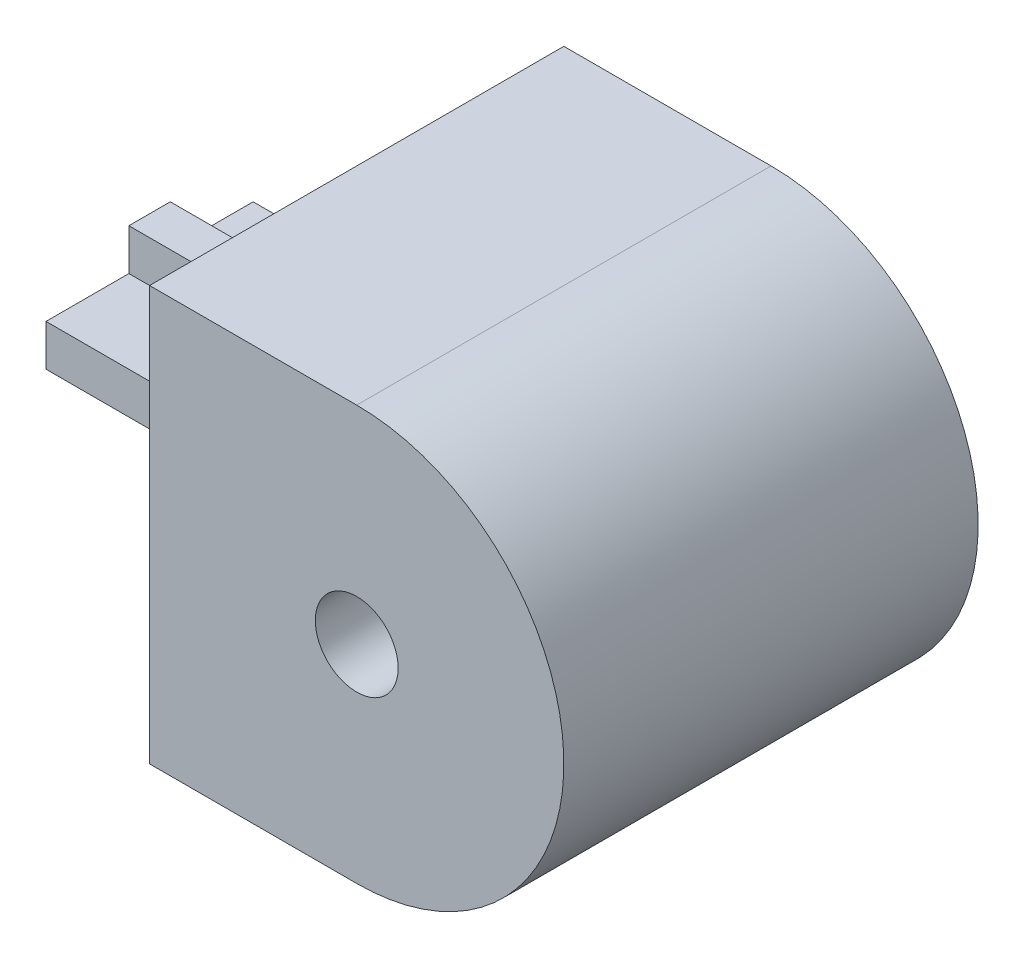
ISO-10303-21;
HEADER;
FILE_DESCRIPTION(('STEP AP214'),'2;1');
FILE_NAME('part.step','',(''),(''),'','','');
FILE_SCHEMA(('AUTOMOTIVE_DESIGN { 1 0 10303 214 1 1 1 1 }'));
ENDSEC;
DATA;
#1=APPLICATION_CONTEXT('core data for automotive mechanical design processes');
#2=APPLICATION_PROTOCOL_DEFINITION('international standard','automotive_design',2000,#1);
#3=PRODUCT_CONTEXT('',#1,'mechanical');
#4=PRODUCT('Part','Part','',(#3));
#5=PRODUCT_RELATED_PRODUCT_CATEGORY('part','',(#4));
#6=PRODUCT_DEFINITION_FORMATION('','',#4);
#7=PRODUCT_DEFINITION_CONTEXT('part definition',#1,'design');
#8=PRODUCT_DEFINITION('design','',#6,#7);
#9=PRODUCT_DEFINITION_SHAPE('','',#8);
#10=(LENGTH_UNIT() NAMED_UNIT(*) SI_UNIT(.MILLI.,.METRE.));
#11=(NAMED_UNIT(*) PLANE_ANGLE_UNIT() SI_UNIT($,.RADIAN.));
#12=(NAMED_UNIT(*) SI_UNIT($,.STERADIAN.) SOLID_ANGLE_UNIT());
#13=UNCERTAINTY_MEASURE_WITH_UNIT(LENGTH_MEASURE(1.E-05),#10,'distance_accuracy_value','');
#14=(GEOMETRIC_REPRESENTATION_CONTEXT(3) GLOBAL_UNCERTAINTY_ASSIGNED_CONTEXT((#13)) GLOBAL_UNIT_ASSIGNED_CONTEXT((#10,
#11,#12)) REPRESENTATION_CONTEXT('',''));
#15=CARTESIAN_POINT('',(0.,0.,0.));
#16=DIRECTION('',(0.,0.,1.));
#17=DIRECTION('',(1.,0.,0.));
#18=AXIS2_PLACEMENT_3D('',#15,#16,#17);
#19=CARTESIAN_POINT('',(0.,5.,5.));
#20=DIRECTION('',(1.,0.,0.));
#21=DIRECTION('',(0.,0.,-1.));
#22=AXIS2_PLACEMENT_3D('',#19,#20,#21);
#23=PLANE('',#22);
#24=DIRECTION('',(0.,-1.,0.));
#25=VECTOR('',#24,1.);
#26=CARTESIAN_POINT('',(0.,5.,0.));
#27=LINE('',#26,#25);
#28=CARTESIAN_POINT('',(0.,5.,0.));
#29=VERTEX_POINT('',#28);
#30=CARTESIAN_POINT('',(0.,0.,0.));
#31=VERTEX_POINT('',#30);
#32=EDGE_CURVE('E181',#29,#31,#27,.T.);
#33=ORIENTED_EDGE('',*,*,#32,.T.);
#34=DIRECTION('',(0.,0.,-1.));
#35=VECTOR('',#34,1.);
#36=CARTESIAN_POINT('',(0.,0.,5.));
#37=LINE('',#36,#35);
#38=CARTESIAN_POINT('',(0.,0.,5.));
#39=VERTEX_POINT('',#38);
#40=EDGE_CURVE('E11',#39,#31,#37,.T.);
#41=ORIENTED_EDGE('',*,*,#40,.F.);
#42=DIRECTION('',(0.,-1.,0.));
#43=VECTOR('',#42,1.);
#44=CARTESIAN_POINT('',(0.,5.,5.));
#45=LINE('',#44,#43);
#46=CARTESIAN_POINT('',(0.,5.,5.));
#47=VERTEX_POINT('',#46);
#48=EDGE_CURVE('E183',#47,#39,#45,.T.);
#49=ORIENTED_EDGE('',*,*,#48,.F.);
#50=DIRECTION('',(0.,0.,-1.));
#51=VECTOR('',#50,1.);
#52=CARTESIAN_POINT('',(0.,5.,5.));
#53=LINE('',#52,#51);
#54=EDGE_CURVE('E193',#47,#29,#53,.T.);
#55=ORIENTED_EDGE('',*,*,#54,.T.);
#56=EDGE_LOOP('',(#33,#41,#49,#55));
#57=FACE_BOUND('',#56,.T.);
#58=DIRECTION('',(0.,0.,-1.));
#59=VECTOR('',#58,1.);
#60=CARTESIAN_POINT('',(0.,2.75,1.25));
#61=LINE('',#60,#59);
#62=CARTESIAN_POINT('',(0.,2.75,2.25));
#63=VERTEX_POINT('',#62);
#64=CARTESIAN_POINT('',(0.,2.75,1.25));
#65=VERTEX_POINT('',#64);
#66=EDGE_CURVE('E170',#63,#65,#61,.T.);
#67=ORIENTED_EDGE('',*,*,#66,.F.);
#68=DIRECTION('',(0.,-1.,0.));
#69=VECTOR('',#68,1.);
#70=CARTESIAN_POINT('',(0.,2.75,2.25));
#71=LINE('',#70,#69);
#72=CARTESIAN_POINT('',(0.,3.25,2.25));
#73=VERTEX_POINT('',#72);
#74=EDGE_CURVE('E167',#73,#63,#71,.T.);
#75=ORIENTED_EDGE('',*,*,#74,.F.);
#76=DIRECTION('',(0.,0.,-1.));
#77=VECTOR('',#76,1.);
#78=CARTESIAN_POINT('',(0.,3.25,2.25));
#79=LINE('',#78,#77);
#80=CARTESIAN_POINT('',(0.,3.25,2.75));
#81=VERTEX_POINT('',#80);
#82=EDGE_CURVE('E455',#81,#73,#79,.T.);
#83=ORIENTED_EDGE('',*,*,#82,.F.);
#84=DIRECTION('',(0.,1.,0.));
#85=VECTOR('',#84,1.);
#86=CARTESIAN_POINT('',(0.,3.25,2.75));
#87=LINE('',#86,#85);
#88=CARTESIAN_POINT('',(0.,2.75,2.75));
#89=VERTEX_POINT('',#88);
#90=EDGE_CURVE('E510',#89,#81,#87,.T.);
#91=ORIENTED_EDGE('',*,*,#90,.F.);
#92=DIRECTION('',(0.,0.,-1.));
#93=VECTOR('',#92,1.);
#94=CARTESIAN_POINT('',(0.,2.75,2.75));
#95=LINE('',#94,#93);
#96=CARTESIAN_POINT('',(0.,2.75,3.75));
#97=VERTEX_POINT('',#96);
#98=EDGE_CURVE('E507',#97,#89,#95,.T.);
#99=ORIENTED_EDGE('',*,*,#98,.F.);
#100=DIRECTION('',(0.,1.,0.));
#101=VECTOR('',#100,1.);
#102=CARTESIAN_POINT('',(0.,2.75,3.75));
#103=LINE('',#102,#101);
#104=CARTESIAN_POINT('',(0.,2.25,3.75));
#105=VERTEX_POINT('',#104);
#106=EDGE_CURVE('E504',#105,#97,#103,.T.);
#107=ORIENTED_EDGE('',*,*,#106,.F.);
#108=DIRECTION('',(0.,0.,1.));
#109=VECTOR('',#108,1.);
#110=CARTESIAN_POINT('',(0.,2.25,3.75));
#111=LINE('',#110,#109);
#112=CARTESIAN_POINT('',(0.,2.25,2.75));
#113=VERTEX_POINT('',#112);
#114=EDGE_CURVE('E501',#113,#105,#111,.T.);
#115=ORIENTED_EDGE('',*,*,#114,.F.);
#116=DIRECTION('',(0.,1.,0.));
#117=VECTOR('',#116,1.);
#118=CARTESIAN_POINT('',(0.,2.25,2.75));
#119=LINE('',#118,#117);
#120=CARTESIAN_POINT('',(0.,1.75,2.75));
#121=VERTEX_POINT('',#120);
#122=EDGE_CURVE('E498',#121,#113,#119,.T.);
#123=ORIENTED_EDGE('',*,*,#122,.F.);
#124=DIRECTION('',(0.,0.,1.));
#125=VECTOR('',#124,1.);
#126=CARTESIAN_POINT('',(0.,1.75,2.75));
#127=LINE('',#126,#125);
#128=CARTESIAN_POINT('',(0.,1.75,2.25));
#129=VERTEX_POINT('',#128);
#130=EDGE_CURVE('E491',#129,#121,#127,.T.);
#131=ORIENTED_EDGE('',*,*,#130,.F.);
#132=DIRECTION('',(0.,-1.,0.));
#133=VECTOR('',#132,1.);
#134=CARTESIAN_POINT('',(0.,1.75,2.25));
#135=LINE('',#134,#133);
#136=CARTESIAN_POINT('',(0.,2.25,2.25));
#137=VERTEX_POINT('',#136);
#138=EDGE_CURVE('E488',#137,#129,#135,.T.);
#139=ORIENTED_EDGE('',*,*,#138,.F.);
#140=DIRECTION('',(0.,0.,1.));
#141=VECTOR('',#140,1.);
#142=CARTESIAN_POINT('',(0.,2.25,2.25));
#143=LINE('',#142,#141);
#144=CARTESIAN_POINT('',(0.,2.25,1.25));
#145=VERTEX_POINT('',#144);
#146=EDGE_CURVE('E57',#145,#137,#143,.T.);
#147=ORIENTED_EDGE('',*,*,#146,.F.);
#148=DIRECTION('',(0.,-1.,0.));
#149=VECTOR('',#148,1.);
#150=CARTESIAN_POINT('',(0.,2.25,1.25));
#151=LINE('',#150,#149);
#152=EDGE_CURVE('E52',#65,#145,#151,.T.);
#153=ORIENTED_EDGE('',*,*,#152,.F.);
#154=EDGE_LOOP('',(#67,#75,#83,#91,#99,#107,#115,#123,#131,#139,#147,#153));
#155=FACE_BOUND('',#154,.T.);
#156=ADVANCED_FACE('F38',(#57,#155),#23,.F.);
#157=CARTESIAN_POINT('',(0.,0.,5.));
#158=DIRECTION('',(0.,1.,0.));
#159=DIRECTION('',(0.,0.,1.));
#160=AXIS2_PLACEMENT_3D('',#157,#158,#159);
#161=PLANE('',#160);
#162=DIRECTION('',(1.,0.,0.));
#163=VECTOR('',#162,1.);
#164=CARTESIAN_POINT('',(0.,0.,0.));
#165=LINE('',#164,#163);
#166=CARTESIAN_POINT('',(2.5,0.,0.));
#167=VERTEX_POINT('',#166);
#168=EDGE_CURVE('E196',#31,#167,#165,.T.);
#169=ORIENTED_EDGE('',*,*,#168,.T.);
#170=DIRECTION('',(0.,0.,-1.));
#171=VECTOR('',#170,1.);
#172=CARTESIAN_POINT('',(2.5,0.,5.));
#173=LINE('',#172,#171);
#174=CARTESIAN_POINT('',(2.5,0.,5.));
#175=VERTEX_POINT('',#174);
#176=EDGE_CURVE('E45',#175,#167,#173,.T.);
#177=ORIENTED_EDGE('',*,*,#176,.F.);
#178=DIRECTION('',(1.,0.,0.));
#179=VECTOR('',#178,1.);
#180=CARTESIAN_POINT('',(0.,0.,5.));
#181=LINE('',#180,#179);
#182=EDGE_CURVE('E186',#39,#175,#181,.T.);
#183=ORIENTED_EDGE('',*,*,#182,.F.);
#184=ORIENTED_EDGE('',*,*,#40,.T.);
#185=EDGE_LOOP('',(#169,#177,#183,#184));
#186=FACE_BOUND('',#185,.T.);
#187=ADVANCED_FACE('F226',(#186),#161,.F.);
#188=CARTESIAN_POINT('',(2.5,2.5,5.));
#189=DIRECTION('',(0.,0.,-1.));
#190=DIRECTION('',(-1.,0.,0.));
#191=AXIS2_PLACEMENT_3D('',#188,#189,#190);
#192=CYLINDRICAL_SURFACE('',#191,2.5);
#193=CARTESIAN_POINT('',(2.5,2.5,0.));
#194=DIRECTION('',(0.,0.,1.));
#195=DIRECTION('',(1.,0.,0.));
#196=AXIS2_PLACEMENT_3D('',#193,#194,#195);
#197=CIRCLE('',#196,2.5);
#198=CARTESIAN_POINT('',(2.5,5.,0.));
#199=VERTEX_POINT('',#198);
#200=EDGE_CURVE('E198',#167,#199,#197,.T.);
#201=ORIENTED_EDGE('',*,*,#200,.T.);
#202=DIRECTION('',(0.,0.,-1.));
#203=VECTOR('',#202,1.);
#204=CARTESIAN_POINT('',(2.5,5.,5.));
#205=LINE('',#204,#203);
#206=CARTESIAN_POINT('',(2.5,5.,5.));
#207=VERTEX_POINT('',#206);
#208=EDGE_CURVE('E203',#207,#199,#205,.T.);
#209=ORIENTED_EDGE('',*,*,#208,.F.);
#210=CARTESIAN_POINT('',(2.5,2.5,5.));
#211=DIRECTION('',(0.,0.,1.));
#212=DIRECTION('',(1.,0.,0.));
#213=AXIS2_PLACEMENT_3D('',#210,#211,#212);
#214=CIRCLE('',#213,2.5);
#215=EDGE_CURVE('E189',#175,#207,#214,.T.);
#216=ORIENTED_EDGE('',*,*,#215,.F.);
#217=ORIENTED_EDGE('',*,*,#176,.T.);
#218=EDGE_LOOP('',(#201,#209,#216,#217));
#219=FACE_BOUND('',#218,.T.);
#220=ADVANCED_FACE('F210',(#219),#192,.T.);
#221=CARTESIAN_POINT('',(0.,5.,5.));
#222=DIRECTION('',(0.,-1.,0.));
#223=DIRECTION('',(0.,0.,-1.));
#224=AXIS2_PLACEMENT_3D('',#221,#222,#223);
#225=PLANE('',#224);
#226=DIRECTION('',(-1.,0.,0.));
#227=VECTOR('',#226,1.);
#228=CARTESIAN_POINT('',(0.,5.,0.));
#229=LINE('',#228,#227);
#230=EDGE_CURVE('E187',#199,#29,#229,.T.);
#231=ORIENTED_EDGE('',*,*,#230,.T.);
#232=ORIENTED_EDGE('',*,*,#54,.F.);
#233=DIRECTION('',(-1.,0.,0.));
#234=VECTOR('',#233,1.);
#235=CARTESIAN_POINT('',(0.,5.,5.));
#236=LINE('',#235,#234);
#237=EDGE_CURVE('E191',#207,#47,#236,.T.);
#238=ORIENTED_EDGE('',*,*,#237,.F.);
#239=ORIENTED_EDGE('',*,*,#208,.T.);
#240=EDGE_LOOP('',(#231,#232,#238,#239));
#241=FACE_BOUND('',#240,.T.);
#242=ADVANCED_FACE('F219',(#241),#225,.F.);
#243=CARTESIAN_POINT('',(2.5,2.5,5.));
#244=DIRECTION('',(0.,0.,1.));
#245=DIRECTION('',(1.,0.,0.));
#246=AXIS2_PLACEMENT_3D('',#243,#244,#245);
#247=PLANE('',#246);
#248=CARTESIAN_POINT('',(2.5,2.5,5.));
#249=DIRECTION('',(0.,0.,1.));
#250=DIRECTION('',(1.,0.,0.));
#251=AXIS2_PLACEMENT_3D('',#248,#249,#250);
#252=CIRCLE('',#251,0.5);
#253=CARTESIAN_POINT('',(3.,2.5,5.));
#254=VERTEX_POINT('',#253);
#255=EDGE_CURVE('E174',#254,#254,#252,.T.);
#256=ORIENTED_EDGE('',*,*,#255,.F.);
#257=EDGE_LOOP('',(#256));
#258=FACE_BOUND('',#257,.T.);
#259=ORIENTED_EDGE('',*,*,#48,.T.);
#260=ORIENTED_EDGE('',*,*,#182,.T.);
#261=ORIENTED_EDGE('',*,*,#215,.T.);
#262=ORIENTED_EDGE('',*,*,#237,.T.);
#263=EDGE_LOOP('',(#259,#260,#261,#262));
#264=FACE_BOUND('',#263,.T.);
#265=ADVANCED_FACE('F225',(#258,#264),#247,.T.);
#266=CARTESIAN_POINT('',(2.5,2.5,0.));
#267=DIRECTION('',(0.,0.,1.));
#268=DIRECTION('',(1.,0.,0.));
#269=AXIS2_PLACEMENT_3D('',#266,#267,#268);
#270=PLANE('',#269);
#271=CARTESIAN_POINT('',(2.5,2.5,0.));
#272=DIRECTION('',(0.,0.,1.));
#273=DIRECTION('',(1.,0.,0.));
#274=AXIS2_PLACEMENT_3D('',#271,#272,#273);
#275=CIRCLE('',#274,0.5);
#276=CARTESIAN_POINT('',(3.,2.5,0.));
#277=VERTEX_POINT('',#276);
#278=EDGE_CURVE('E171',#277,#277,#275,.T.);
#279=ORIENTED_EDGE('',*,*,#278,.T.);
#280=EDGE_LOOP('',(#279));
#281=FACE_BOUND('',#280,.T.);
#282=ORIENTED_EDGE('',*,*,#32,.F.);
#283=ORIENTED_EDGE('',*,*,#230,.F.);
#284=ORIENTED_EDGE('',*,*,#200,.F.);
#285=ORIENTED_EDGE('',*,*,#168,.F.);
#286=EDGE_LOOP('',(#282,#283,#284,#285));
#287=FACE_BOUND('',#286,.T.);
#288=ADVANCED_FACE('F216',(#281,#287),#270,.F.);
#289=CARTESIAN_POINT('',(2.5,2.5,5.));
#290=DIRECTION('',(0.,0.,-1.));
#291=DIRECTION('',(-1.,0.,0.));
#292=AXIS2_PLACEMENT_3D('',#289,#290,#291);
#293=CYLINDRICAL_SURFACE('',#292,0.5);
#294=ORIENTED_EDGE('',*,*,#255,.T.);
#295=EDGE_LOOP('',(#294));
#296=FACE_BOUND('',#295,.T.);
#297=ORIENTED_EDGE('',*,*,#278,.F.);
#298=EDGE_LOOP('',(#297));
#299=FACE_BOUND('',#298,.T.);
#300=ADVANCED_FACE('F238',(#296,#299),#293,.F.);
#301=CARTESIAN_POINT('',(-2.5,2.75,1.25));
#302=DIRECTION('',(0.,-1.,0.));
#303=DIRECTION('',(0.,0.,-1.));
#304=AXIS2_PLACEMENT_3D('',#301,#302,#303);
#305=PLANE('',#304);
#306=ORIENTED_EDGE('',*,*,#66,.T.);
#307=DIRECTION('',(1.,0.,0.));
#308=VECTOR('',#307,1.);
#309=CARTESIAN_POINT('',(-2.5,2.75,1.25));
#310=LINE('',#309,#308);
#311=CARTESIAN_POINT('',(-2.5,2.75,1.25));
#312=VERTEX_POINT('',#311);
#313=EDGE_CURVE('E151',#312,#65,#310,.T.);
#314=ORIENTED_EDGE('',*,*,#313,.F.);
#315=DIRECTION('',(0.,0.,-1.));
#316=VECTOR('',#315,1.);
#317=CARTESIAN_POINT('',(-2.5,2.75,1.25));
#318=LINE('',#317,#316);
#319=CARTESIAN_POINT('',(-2.5,2.75,2.25));
#320=VERTEX_POINT('',#319);
#321=EDGE_CURVE('E158',#320,#312,#318,.T.);
#322=ORIENTED_EDGE('',*,*,#321,.F.);
#323=DIRECTION('',(1.,0.,0.));
#324=VECTOR('',#323,1.);
#325=CARTESIAN_POINT('',(-2.5,2.75,2.25));
#326=LINE('',#325,#324);
#327=EDGE_CURVE('E451',#320,#63,#326,.T.);
#328=ORIENTED_EDGE('',*,*,#327,.T.);
#329=EDGE_LOOP('',(#306,#314,#322,#328));
#330=FACE_BOUND('',#329,.T.);
#331=ADVANCED_FACE('F169',(#330),#305,.F.);
#332=CARTESIAN_POINT('',(-2.5,2.25,1.25));
#333=DIRECTION('',(0.,0.,1.));
#334=DIRECTION('',(1.,0.,0.));
#335=AXIS2_PLACEMENT_3D('',#332,#333,#334);
#336=PLANE('',#335);
#337=ORIENTED_EDGE('',*,*,#152,.T.);
#338=DIRECTION('',(1.,0.,0.));
#339=VECTOR('',#338,1.);
#340=CARTESIAN_POINT('',(-2.5,2.25,1.25));
#341=LINE('',#340,#339);
#342=CARTESIAN_POINT('',(-2.5,2.25,1.25));
#343=VERTEX_POINT('',#342);
#344=EDGE_CURVE('E154',#343,#145,#341,.T.);
#345=ORIENTED_EDGE('',*,*,#344,.F.);
#346=DIRECTION('',(0.,-1.,0.));
#347=VECTOR('',#346,1.);
#348=CARTESIAN_POINT('',(-2.5,2.25,1.25));
#349=LINE('',#348,#347);
#350=EDGE_CURVE('E147',#312,#343,#349,.T.);
#351=ORIENTED_EDGE('',*,*,#350,.F.);
#352=ORIENTED_EDGE('',*,*,#313,.T.);
#353=EDGE_LOOP('',(#337,#345,#351,#352));
#354=FACE_BOUND('',#353,.T.);
#355=ADVANCED_FACE('F149',(#354),#336,.F.);
#356=CARTESIAN_POINT('',(-2.5,2.25,2.25));
#357=DIRECTION('',(0.,1.,0.));
#358=DIRECTION('',(0.,0.,1.));
#359=AXIS2_PLACEMENT_3D('',#356,#357,#358);
#360=PLANE('',#359);
#361=ORIENTED_EDGE('',*,*,#146,.T.);
#362=DIRECTION('',(1.,0.,0.));
#363=VECTOR('',#362,1.);
#364=CARTESIAN_POINT('',(-2.5,2.25,2.25));
#365=LINE('',#364,#363);
#366=CARTESIAN_POINT('',(-2.5,2.25,2.25));
#367=VERTEX_POINT('',#366);
#368=EDGE_CURVE('E176',#367,#137,#365,.T.);
#369=ORIENTED_EDGE('',*,*,#368,.F.);
#370=DIRECTION('',(0.,0.,1.));
#371=VECTOR('',#370,1.);
#372=CARTESIAN_POINT('',(-2.5,2.25,2.25));
#373=LINE('',#372,#371);
#374=EDGE_CURVE('E157',#343,#367,#373,.T.);
#375=ORIENTED_EDGE('',*,*,#374,.F.);
#376=ORIENTED_EDGE('',*,*,#344,.T.);
#377=EDGE_LOOP('',(#361,#369,#375,#376));
#378=FACE_BOUND('',#377,.T.);
#379=ADVANCED_FACE('F250',(#378),#360,.F.);
#380=CARTESIAN_POINT('',(-2.5,1.75,2.25));
#381=DIRECTION('',(0.,0.,1.));
#382=DIRECTION('',(1.,0.,0.));
#383=AXIS2_PLACEMENT_3D('',#380,#381,#382);
#384=PLANE('',#383);
#385=ORIENTED_EDGE('',*,*,#138,.T.);
#386=DIRECTION('',(1.,0.,0.));
#387=VECTOR('',#386,1.);
#388=CARTESIAN_POINT('',(-2.5,1.75,2.25));
#389=LINE('',#388,#387);
#390=CARTESIAN_POINT('',(-2.5,1.75,2.25));
#391=VERTEX_POINT('',#390);
#392=EDGE_CURVE('E481',#391,#129,#389,.T.);
#393=ORIENTED_EDGE('',*,*,#392,.F.);
#394=DIRECTION('',(0.,-1.,0.));
#395=VECTOR('',#394,1.);
#396=CARTESIAN_POINT('',(-2.5,1.75,2.25));
#397=LINE('',#396,#395);
#398=EDGE_CURVE('E489',#367,#391,#397,.T.);
#399=ORIENTED_EDGE('',*,*,#398,.F.);
#400=ORIENTED_EDGE('',*,*,#368,.T.);
#401=EDGE_LOOP('',(#385,#393,#399,#400));
#402=FACE_BOUND('',#401,.T.);
#403=ADVANCED_FACE('F253',(#402),#384,.F.);
#404=CARTESIAN_POINT('',(-2.5,1.75,2.75));
#405=DIRECTION('',(0.,1.,0.));
#406=DIRECTION('',(0.,0.,1.));
#407=AXIS2_PLACEMENT_3D('',#404,#405,#406);
#408=PLANE('',#407);
#409=ORIENTED_EDGE('',*,*,#130,.T.);
#410=DIRECTION('',(1.,0.,0.));
#411=VECTOR('',#410,1.);
#412=CARTESIAN_POINT('',(-2.5,1.75,2.75));
#413=LINE('',#412,#411);
#414=CARTESIAN_POINT('',(-2.5,1.75,2.75));
#415=VERTEX_POINT('',#414);
#416=EDGE_CURVE('E478',#415,#121,#413,.T.);
#417=ORIENTED_EDGE('',*,*,#416,.F.);
#418=DIRECTION('',(0.,0.,1.));
#419=VECTOR('',#418,1.);
#420=CARTESIAN_POINT('',(-2.5,1.75,2.75));
#421=LINE('',#420,#419);
#422=EDGE_CURVE('E530',#391,#415,#421,.T.);
#423=ORIENTED_EDGE('',*,*,#422,.F.);
#424=ORIENTED_EDGE('',*,*,#392,.T.);
#425=EDGE_LOOP('',(#409,#417,#423,#424));
#426=FACE_BOUND('',#425,.T.);
#427=ADVANCED_FACE('F257',(#426),#408,.F.);
#428=CARTESIAN_POINT('',(-2.5,2.25,2.75));
#429=DIRECTION('',(0.,0.,-1.));
#430=DIRECTION('',(0.,1.,0.));
#431=AXIS2_PLACEMENT_3D('',#428,#429,#430);
#432=PLANE('',#431);
#433=ORIENTED_EDGE('',*,*,#122,.T.);
#434=DIRECTION('',(1.,0.,0.));
#435=VECTOR('',#434,1.);
#436=CARTESIAN_POINT('',(-2.5,2.25,2.75));
#437=LINE('',#436,#435);
#438=CARTESIAN_POINT('',(-2.5,2.25,2.75));
#439=VERTEX_POINT('',#438);
#440=EDGE_CURVE('E475',#439,#113,#437,.T.);
#441=ORIENTED_EDGE('',*,*,#440,.F.);
#442=DIRECTION('',(0.,1.,0.));
#443=VECTOR('',#442,1.);
#444=CARTESIAN_POINT('',(-2.5,2.25,2.75));
#445=LINE('',#444,#443);
#446=EDGE_CURVE('E528',#415,#439,#445,.T.);
#447=ORIENTED_EDGE('',*,*,#446,.F.);
#448=ORIENTED_EDGE('',*,*,#416,.T.);
#449=EDGE_LOOP('',(#433,#441,#447,#448));
#450=FACE_BOUND('',#449,.T.);
#451=ADVANCED_FACE('F261',(#450),#432,.F.);
#452=CARTESIAN_POINT('',(-2.5,2.25,3.75));
#453=DIRECTION('',(0.,1.,0.));
#454=DIRECTION('',(0.,0.,1.));
#455=AXIS2_PLACEMENT_3D('',#452,#453,#454);
#456=PLANE('',#455);
#457=ORIENTED_EDGE('',*,*,#114,.T.);
#458=DIRECTION('',(1.,0.,0.));
#459=VECTOR('',#458,1.);
#460=CARTESIAN_POINT('',(-2.5,2.25,3.75));
#461=LINE('',#460,#459);
#462=CARTESIAN_POINT('',(-2.5,2.25,3.75));
#463=VERTEX_POINT('',#462);
#464=EDGE_CURVE('E472',#463,#105,#461,.T.);
#465=ORIENTED_EDGE('',*,*,#464,.F.);
#466=DIRECTION('',(0.,0.,1.));
#467=VECTOR('',#466,1.);
#468=CARTESIAN_POINT('',(-2.5,2.25,3.75));
#469=LINE('',#468,#467);
#470=EDGE_CURVE('E524',#439,#463,#469,.T.);
#471=ORIENTED_EDGE('',*,*,#470,.F.);
#472=ORIENTED_EDGE('',*,*,#440,.T.);
#473=EDGE_LOOP('',(#457,#465,#471,#472));
#474=FACE_BOUND('',#473,.T.);
#475=ADVANCED_FACE('F265',(#474),#456,.F.);
#476=CARTESIAN_POINT('',(-2.5,2.75,3.75));
#477=DIRECTION('',(0.,0.,-1.));
#478=DIRECTION('',(-1.,0.,0.));
#479=AXIS2_PLACEMENT_3D('',#476,#477,#478);
#480=PLANE('',#479);
#481=ORIENTED_EDGE('',*,*,#106,.T.);
#482=DIRECTION('',(1.,0.,0.));
#483=VECTOR('',#482,1.);
#484=CARTESIAN_POINT('',(-2.5,2.75,3.75));
#485=LINE('',#484,#483);
#486=CARTESIAN_POINT('',(-2.5,2.75,3.75));
#487=VERTEX_POINT('',#486);
#488=EDGE_CURVE('E469',#487,#97,#485,.T.);
#489=ORIENTED_EDGE('',*,*,#488,.F.);
#490=DIRECTION('',(0.,1.,0.));
#491=VECTOR('',#490,1.);
#492=CARTESIAN_POINT('',(-2.5,2.75,3.75));
#493=LINE('',#492,#491);
#494=EDGE_CURVE('E522',#463,#487,#493,.T.);
#495=ORIENTED_EDGE('',*,*,#494,.F.);
#496=ORIENTED_EDGE('',*,*,#464,.T.);
#497=EDGE_LOOP('',(#481,#489,#495,#496));
#498=FACE_BOUND('',#497,.T.);
#499=ADVANCED_FACE('F269',(#498),#480,.F.);
#500=CARTESIAN_POINT('',(-2.5,2.75,2.75));
#501=DIRECTION('',(0.,-1.,0.));
#502=DIRECTION('',(0.,0.,-1.));
#503=AXIS2_PLACEMENT_3D('',#500,#501,#502);
#504=PLANE('',#503);
#505=ORIENTED_EDGE('',*,*,#98,.T.);
#506=DIRECTION('',(1.,0.,0.));
#507=VECTOR('',#506,1.);
#508=CARTESIAN_POINT('',(-2.5,2.75,2.75));
#509=LINE('',#508,#507);
#510=CARTESIAN_POINT('',(-2.5,2.75,2.75));
#511=VERTEX_POINT('',#510);
#512=EDGE_CURVE('E466',#511,#89,#509,.T.);
#513=ORIENTED_EDGE('',*,*,#512,.F.);
#514=DIRECTION('',(0.,0.,-1.));
#515=VECTOR('',#514,1.);
#516=CARTESIAN_POINT('',(-2.5,2.75,2.75));
#517=LINE('',#516,#515);
#518=EDGE_CURVE('E518',#487,#511,#517,.T.);
#519=ORIENTED_EDGE('',*,*,#518,.F.);
#520=ORIENTED_EDGE('',*,*,#488,.T.);
#521=EDGE_LOOP('',(#505,#513,#519,#520));
#522=FACE_BOUND('',#521,.T.);
#523=ADVANCED_FACE('F273',(#522),#504,.F.);
#524=CARTESIAN_POINT('',(-2.5,3.25,2.75));
#525=DIRECTION('',(0.,0.,-1.));
#526=DIRECTION('',(0.,1.,0.));
#527=AXIS2_PLACEMENT_3D('',#524,#525,#526);
#528=PLANE('',#527);
#529=ORIENTED_EDGE('',*,*,#90,.T.);
#530=DIRECTION('',(1.,0.,0.));
#531=VECTOR('',#530,1.);
#532=CARTESIAN_POINT('',(-2.5,3.25,2.75));
#533=LINE('',#532,#531);
#534=CARTESIAN_POINT('',(-2.5,3.25,2.75));
#535=VERTEX_POINT('',#534);
#536=EDGE_CURVE('E458',#535,#81,#533,.T.);
#537=ORIENTED_EDGE('',*,*,#536,.F.);
#538=DIRECTION('',(0.,1.,0.));
#539=VECTOR('',#538,1.);
#540=CARTESIAN_POINT('',(-2.5,3.25,2.75));
#541=LINE('',#540,#539);
#542=EDGE_CURVE('E516',#511,#535,#541,.T.);
#543=ORIENTED_EDGE('',*,*,#542,.F.);
#544=ORIENTED_EDGE('',*,*,#512,.T.);
#545=EDGE_LOOP('',(#529,#537,#543,#544));
#546=FACE_BOUND('',#545,.T.);
#547=ADVANCED_FACE('F277',(#546),#528,.F.);
#548=CARTESIAN_POINT('',(-2.5,3.25,2.25));
#549=DIRECTION('',(0.,-1.,0.));
#550=DIRECTION('',(0.,0.,-1.));
#551=AXIS2_PLACEMENT_3D('',#548,#549,#550);
#552=PLANE('',#551);
#553=ORIENTED_EDGE('',*,*,#82,.T.);
#554=DIRECTION('',(1.,0.,0.));
#555=VECTOR('',#554,1.);
#556=CARTESIAN_POINT('',(-2.5,3.25,2.25));
#557=LINE('',#556,#555);
#558=CARTESIAN_POINT('',(-2.5,3.25,2.25));
#559=VERTEX_POINT('',#558);
#560=EDGE_CURVE('E453',#559,#73,#557,.T.);
#561=ORIENTED_EDGE('',*,*,#560,.F.);
#562=DIRECTION('',(0.,0.,-1.));
#563=VECTOR('',#562,1.);
#564=CARTESIAN_POINT('',(-2.5,3.25,2.25));
#565=LINE('',#564,#563);
#566=EDGE_CURVE('E460',#535,#559,#565,.T.);
#567=ORIENTED_EDGE('',*,*,#566,.F.);
#568=ORIENTED_EDGE('',*,*,#536,.T.);
#569=EDGE_LOOP('',(#553,#561,#567,#568));
#570=FACE_BOUND('',#569,.T.);
#571=ADVANCED_FACE('F281',(#570),#552,.F.);
#572=CARTESIAN_POINT('',(-2.5,2.75,2.25));
#573=DIRECTION('',(0.,0.,1.));
#574=DIRECTION('',(1.,0.,0.));
#575=AXIS2_PLACEMENT_3D('',#572,#573,#574);
#576=PLANE('',#575);
#577=ORIENTED_EDGE('',*,*,#74,.T.);
#578=ORIENTED_EDGE('',*,*,#327,.F.);
#579=DIRECTION('',(0.,-1.,0.));
#580=VECTOR('',#579,1.);
#581=CARTESIAN_POINT('',(-2.5,2.75,2.25));
#582=LINE('',#581,#580);
#583=EDGE_CURVE('E163',#559,#320,#582,.T.);
#584=ORIENTED_EDGE('',*,*,#583,.F.);
#585=ORIENTED_EDGE('',*,*,#560,.T.);
#586=EDGE_LOOP('',(#577,#578,#584,#585));
#587=FACE_BOUND('',#586,.T.);
#588=ADVANCED_FACE('F285',(#587),#576,.F.);
#589=CARTESIAN_POINT('',(-2.5,0.,0.));
#590=DIRECTION('',(-1.,0.,0.));
#591=DIRECTION('',(0.,0.,1.));
#592=AXIS2_PLACEMENT_3D('',#589,#590,#591);
#593=PLANE('',#592);
#594=ORIENTED_EDGE('',*,*,#321,.T.);
#595=ORIENTED_EDGE('',*,*,#350,.T.);
#596=ORIENTED_EDGE('',*,*,#374,.T.);
#597=ORIENTED_EDGE('',*,*,#398,.T.);
#598=ORIENTED_EDGE('',*,*,#422,.T.);
#599=ORIENTED_EDGE('',*,*,#446,.T.);
#600=ORIENTED_EDGE('',*,*,#470,.T.);
#601=ORIENTED_EDGE('',*,*,#494,.T.);
#602=ORIENTED_EDGE('',*,*,#518,.T.);
#603=ORIENTED_EDGE('',*,*,#542,.T.);
#604=ORIENTED_EDGE('',*,*,#566,.T.);
#605=ORIENTED_EDGE('',*,*,#583,.T.);
#606=EDGE_LOOP('',(#594,#595,#596,#597,#598,#599,#600,#601,#602,#603,#604,#605));
#607=FACE_BOUND('',#606,.T.);
#608=ADVANCED_FACE('F161',(#607),#593,.T.);
#609=CLOSED_SHELL('',(#156,#187,#220,#242,#265,#288,#300,#331,#355,#379,#403,#427,#451,#475,
#499,#523,#547,#571,#588,#608));
#610=MANIFOLD_SOLID_BREP('B2',#609);
#611=ADVANCED_BREP_SHAPE_REPRESENTATION('',(#18,#610),#14);
#612=SHAPE_DEFINITION_REPRESENTATION(#9,#611);
ENDSEC;
END-ISO-10303-21;
